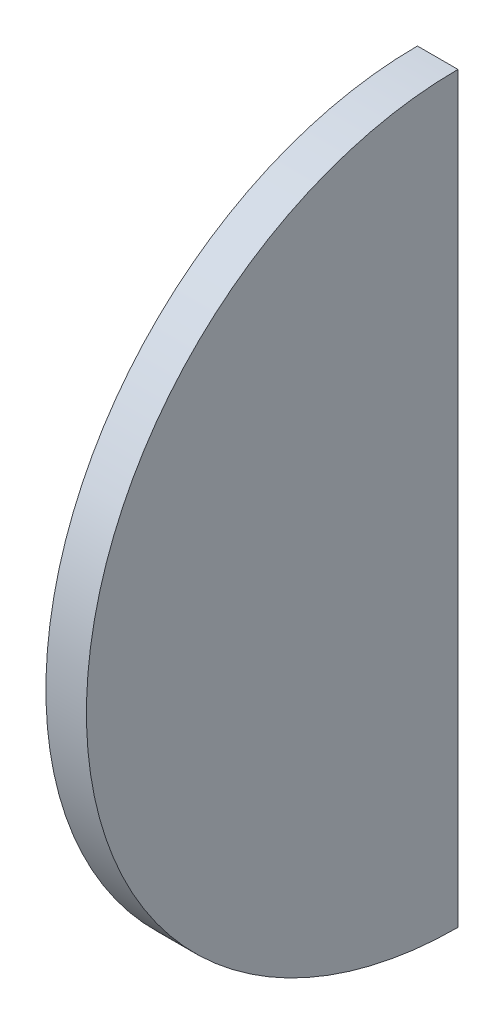
ISO-10303-21;
HEADER;
FILE_DESCRIPTION(('STEP AP214'),'2;1');
FILE_NAME('part.step','',(''),(''),'','','');
FILE_SCHEMA(('AUTOMOTIVE_DESIGN { 1 0 10303 214 1 1 1 1 }'));
ENDSEC;
DATA;
#1=APPLICATION_CONTEXT('core data for automotive mechanical design processes');
#2=APPLICATION_PROTOCOL_DEFINITION('international standard','automotive_design',2000,#1);
#3=PRODUCT_CONTEXT('',#1,'mechanical');
#4=PRODUCT('Part','Part','',(#3));
#5=PRODUCT_RELATED_PRODUCT_CATEGORY('part','',(#4));
#6=PRODUCT_DEFINITION_FORMATION('','',#4);
#7=PRODUCT_DEFINITION_CONTEXT('part definition',#1,'design');
#8=PRODUCT_DEFINITION('design','',#6,#7);
#9=PRODUCT_DEFINITION_SHAPE('','',#8);
#10=(LENGTH_UNIT() NAMED_UNIT(*) SI_UNIT(.MILLI.,.METRE.));
#11=(NAMED_UNIT(*) PLANE_ANGLE_UNIT() SI_UNIT($,.RADIAN.));
#12=(NAMED_UNIT(*) SI_UNIT($,.STERADIAN.) SOLID_ANGLE_UNIT());
#13=UNCERTAINTY_MEASURE_WITH_UNIT(LENGTH_MEASURE(1.E-05),#10,'distance_accuracy_value','');
#14=(GEOMETRIC_REPRESENTATION_CONTEXT(3) GLOBAL_UNCERTAINTY_ASSIGNED_CONTEXT((#13)) GLOBAL_UNIT_ASSIGNED_CONTEXT((#10,
#11,#12)) REPRESENTATION_CONTEXT('',''));
#15=CARTESIAN_POINT('',(0.,0.,0.));
#16=DIRECTION('',(0.,0.,1.));
#17=DIRECTION('',(1.,0.,0.));
#18=AXIS2_PLACEMENT_3D('',#15,#16,#17);
#19=CARTESIAN_POINT('',(76.2,0.,0.));
#20=DIRECTION('',(-1.,0.,0.));
#21=DIRECTION('',(0.,0.,1.));
#22=AXIS2_PLACEMENT_3D('',#19,#20,#21);
#23=CYLINDRICAL_SURFACE('',#22,698.5);
#24=CARTESIAN_POINT('',(0.,0.,0.));
#25=DIRECTION('',(1.,0.,0.));
#26=DIRECTION('',(0.,0.,-1.));
#27=AXIS2_PLACEMENT_3D('',#24,#25,#26);
#28=CIRCLE('',#27,698.5);
#29=CARTESIAN_POINT('',(0.,698.5,0.));
#30=VERTEX_POINT('',#29);
#31=CARTESIAN_POINT('',(0.,-698.5,0.));
#32=VERTEX_POINT('',#31);
#33=EDGE_CURVE('E64',#30,#32,#28,.T.);
#34=ORIENTED_EDGE('',*,*,#33,.T.);
#35=DIRECTION('',(-1.,0.,0.));
#36=VECTOR('',#35,1.);
#37=CARTESIAN_POINT('',(76.2,-698.5,0.));
#38=LINE('',#37,#36);
#39=CARTESIAN_POINT('',(76.2,-698.5,0.));
#40=VERTEX_POINT('',#39);
#41=EDGE_CURVE('E11',#40,#32,#38,.T.);
#42=ORIENTED_EDGE('',*,*,#41,.F.);
#43=CARTESIAN_POINT('',(76.2,0.,0.));
#44=DIRECTION('',(1.,0.,0.));
#45=DIRECTION('',(0.,0.,-1.));
#46=AXIS2_PLACEMENT_3D('',#43,#44,#45);
#47=CIRCLE('',#46,698.5);
#48=CARTESIAN_POINT('',(76.2,698.5,0.));
#49=VERTEX_POINT('',#48);
#50=EDGE_CURVE('E63',#49,#40,#47,.T.);
#51=ORIENTED_EDGE('',*,*,#50,.F.);
#52=DIRECTION('',(-1.,0.,0.));
#53=VECTOR('',#52,1.);
#54=CARTESIAN_POINT('',(76.2,698.5,0.));
#55=LINE('',#54,#53);
#56=EDGE_CURVE('E41',#49,#30,#55,.T.);
#57=ORIENTED_EDGE('',*,*,#56,.T.);
#58=EDGE_LOOP('',(#34,#42,#51,#57));
#59=FACE_BOUND('',#58,.T.);
#60=ADVANCED_FACE('F33',(#59),#23,.T.);
#61=CARTESIAN_POINT('',(76.2,698.5,0.));
#62=DIRECTION('',(0.,0.,1.));
#63=DIRECTION('',(1.,0.,0.));
#64=AXIS2_PLACEMENT_3D('',#61,#62,#63);
#65=PLANE('',#64);
#66=DIRECTION('',(0.,1.,0.));
#67=VECTOR('',#66,1.);
#68=CARTESIAN_POINT('',(0.,698.5,0.));
#69=LINE('',#68,#67);
#70=EDGE_CURVE('E56',#32,#30,#69,.T.);
#71=ORIENTED_EDGE('',*,*,#70,.T.);
#72=ORIENTED_EDGE('',*,*,#56,.F.);
#73=DIRECTION('',(0.,1.,0.));
#74=VECTOR('',#73,1.);
#75=CARTESIAN_POINT('',(76.2,698.5,0.));
#76=LINE('',#75,#74);
#77=EDGE_CURVE('E48',#40,#49,#76,.T.);
#78=ORIENTED_EDGE('',*,*,#77,.F.);
#79=ORIENTED_EDGE('',*,*,#41,.T.);
#80=EDGE_LOOP('',(#71,#72,#78,#79));
#81=FACE_BOUND('',#80,.T.);
#82=ADVANCED_FACE('F59',(#81),#65,.F.);
#83=CARTESIAN_POINT('',(76.2,0.,0.));
#84=DIRECTION('',(1.,0.,0.));
#85=DIRECTION('',(0.,0.,-1.));
#86=AXIS2_PLACEMENT_3D('',#83,#84,#85);
#87=PLANE('',#86);
#88=ORIENTED_EDGE('',*,*,#50,.T.);
#89=ORIENTED_EDGE('',*,*,#77,.T.);
#90=EDGE_LOOP('',(#88,#89));
#91=FACE_BOUND('',#90,.T.);
#92=ADVANCED_FACE('F71',(#91),#87,.T.);
#93=CARTESIAN_POINT('',(0.,0.,0.));
#94=DIRECTION('',(1.,0.,0.));
#95=DIRECTION('',(0.,0.,-1.));
#96=AXIS2_PLACEMENT_3D('',#93,#94,#95);
#97=PLANE('',#96);
#98=ORIENTED_EDGE('',*,*,#33,.F.);
#99=ORIENTED_EDGE('',*,*,#70,.F.);
#100=EDGE_LOOP('',(#98,#99));
#101=FACE_BOUND('',#100,.T.);
#102=ADVANCED_FACE('F67',(#101),#97,.F.);
#103=CLOSED_SHELL('',(#60,#82,#92,#102));
#104=MANIFOLD_SOLID_BREP('B2',#103);
#105=ADVANCED_BREP_SHAPE_REPRESENTATION('',(#18,#104),#14);
#106=SHAPE_DEFINITION_REPRESENTATION(#9,#105);
ENDSEC;
END-ISO-10303-21;
